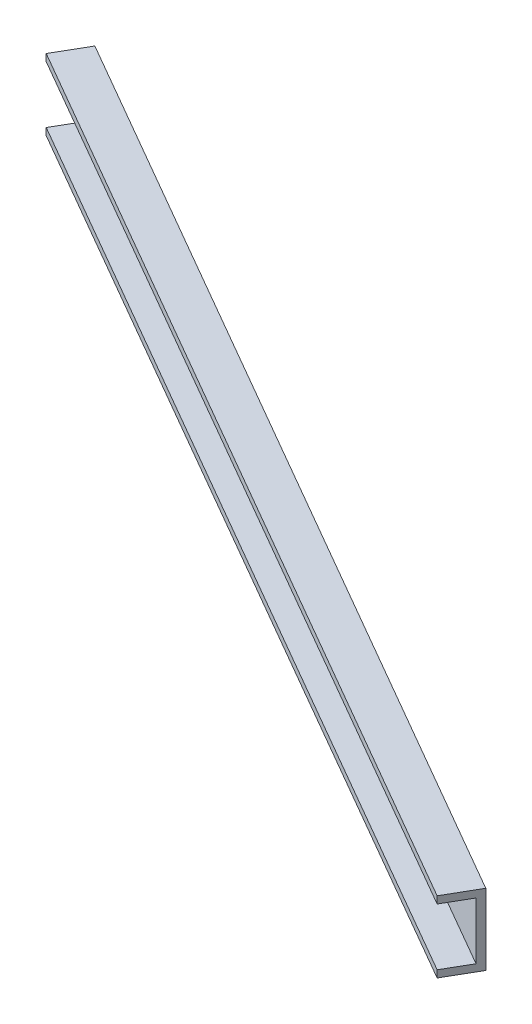
ISO-10303-21;
HEADER;
FILE_DESCRIPTION(('STEP AP214'),'2;1');
FILE_NAME('part.step','',(''),(''),'','','');
FILE_SCHEMA(('AUTOMOTIVE_DESIGN { 1 0 10303 214 1 1 1 1 }'));
ENDSEC;
DATA;
#1=APPLICATION_CONTEXT('core data for automotive mechanical design processes');
#2=APPLICATION_PROTOCOL_DEFINITION('international standard','automotive_design',2000,#1);
#3=PRODUCT_CONTEXT('',#1,'mechanical');
#4=PRODUCT('Part','Part','',(#3));
#5=PRODUCT_RELATED_PRODUCT_CATEGORY('part','',(#4));
#6=PRODUCT_DEFINITION_FORMATION('','',#4);
#7=PRODUCT_DEFINITION_CONTEXT('part definition',#1,'design');
#8=PRODUCT_DEFINITION('design','',#6,#7);
#9=PRODUCT_DEFINITION_SHAPE('','',#8);
#10=(LENGTH_UNIT() NAMED_UNIT(*) SI_UNIT(.MILLI.,.METRE.));
#11=(NAMED_UNIT(*) PLANE_ANGLE_UNIT() SI_UNIT($,.RADIAN.));
#12=(NAMED_UNIT(*) SI_UNIT($,.STERADIAN.) SOLID_ANGLE_UNIT());
#13=UNCERTAINTY_MEASURE_WITH_UNIT(LENGTH_MEASURE(1.E-05),#10,'distance_accuracy_value','');
#14=(GEOMETRIC_REPRESENTATION_CONTEXT(3) GLOBAL_UNCERTAINTY_ASSIGNED_CONTEXT((#13)) GLOBAL_UNIT_ASSIGNED_CONTEXT((#10,
#11,#12)) REPRESENTATION_CONTEXT('',''));
#15=CARTESIAN_POINT('',(0.,0.,0.));
#16=DIRECTION('',(0.,0.,1.));
#17=DIRECTION('',(1.,0.,0.));
#18=AXIS2_PLACEMENT_3D('',#15,#16,#17);
#19=CARTESIAN_POINT('',(-263.807621135332,7.99999999999996,-143.071796769724));
#20=DIRECTION('',(0.,-1.,0.));
#21=DIRECTION('',(0.500000000000001,0.,-0.866025403784439));
#22=AXIS2_PLACEMENT_3D('',#19,#20,#21);
#23=PLANE('',#22);
#24=DIRECTION('',(0.500000000000001,0.,-0.866025403784439));
#25=VECTOR('',#24,1.);
#26=CARTESIAN_POINT('',(-263.807621135332,7.99999999999996,-143.071796769724));
#27=LINE('',#26,#25);
#28=CARTESIAN_POINT('',(-263.807621135332,7.99999999999996,-143.071796769724));
#29=VERTEX_POINT('',#28);
#30=CARTESIAN_POINT('',(-259.807621135332,7.99999999999996,-150.));
#31=VERTEX_POINT('',#30);
#32=EDGE_CURVE('E11',#29,#31,#27,.T.);
#33=ORIENTED_EDGE('',*,*,#32,.T.);
#34=DIRECTION('',(0.866025403784439,0.,0.5));
#35=VECTOR('',#34,1.);
#36=CARTESIAN_POINT('',(-259.807621135332,7.99999999999996,-150.));
#37=LINE('',#36,#35);
#38=CARTESIAN_POINT('',(0.,8.,0.));
#39=VERTEX_POINT('',#38);
#40=EDGE_CURVE('E140',#31,#39,#37,.T.);
#41=ORIENTED_EDGE('',*,*,#40,.T.);
#42=DIRECTION('',(0.500000000000001,0.,-0.866025403784439));
#43=VECTOR('',#42,1.);
#44=CARTESIAN_POINT('',(-4.,8.,6.92820323027553));
#45=LINE('',#44,#43);
#46=CARTESIAN_POINT('',(-4.,8.,6.92820323027553));
#47=VERTEX_POINT('',#46);
#48=EDGE_CURVE('E134',#47,#39,#45,.T.);
#49=ORIENTED_EDGE('',*,*,#48,.F.);
#50=DIRECTION('',(0.866025403784439,0.,0.5));
#51=VECTOR('',#50,1.);
#52=CARTESIAN_POINT('',(-263.807621135332,7.99999999999996,-143.071796769724));
#53=LINE('',#52,#51);
#54=EDGE_CURVE('E96',#29,#47,#53,.T.);
#55=ORIENTED_EDGE('',*,*,#54,.F.);
#56=EDGE_LOOP('',(#33,#41,#49,#55));
#57=FACE_BOUND('',#56,.T.);
#58=ADVANCED_FACE('F16',(#57),#23,.T.);
#59=CARTESIAN_POINT('',(-259.807621135332,7.99999999999996,-150.));
#60=DIRECTION('',(-0.5,0.,0.866025403784439));
#61=DIRECTION('',(0.,-1.,0.));
#62=AXIS2_PLACEMENT_3D('',#59,#60,#61);
#63=PLANE('',#62);
#64=DIRECTION('',(0.,-1.,0.));
#65=VECTOR('',#64,1.);
#66=CARTESIAN_POINT('',(-259.807621135332,7.99999999999996,-150.));
#67=LINE('',#66,#65);
#68=CARTESIAN_POINT('',(-259.807621135332,-8.00000000000004,-150.));
#69=VERTEX_POINT('',#68);
#70=EDGE_CURVE('E23',#31,#69,#67,.T.);
#71=ORIENTED_EDGE('',*,*,#70,.T.);
#72=DIRECTION('',(0.866025403784439,0.,0.5));
#73=VECTOR('',#72,1.);
#74=CARTESIAN_POINT('',(-259.807621135332,-8.00000000000004,-150.));
#75=LINE('',#74,#73);
#76=CARTESIAN_POINT('',(0.,-8.,0.));
#77=VERTEX_POINT('',#76);
#78=EDGE_CURVE('E136',#69,#77,#75,.T.);
#79=ORIENTED_EDGE('',*,*,#78,.T.);
#80=DIRECTION('',(0.,-1.,0.));
#81=VECTOR('',#80,1.);
#82=CARTESIAN_POINT('',(0.,8.,0.));
#83=LINE('',#82,#81);
#84=EDGE_CURVE('E127',#39,#77,#83,.T.);
#85=ORIENTED_EDGE('',*,*,#84,.F.);
#86=ORIENTED_EDGE('',*,*,#40,.F.);
#87=EDGE_LOOP('',(#71,#79,#85,#86));
#88=FACE_BOUND('',#87,.T.);
#89=ADVANCED_FACE('F142',(#88),#63,.T.);
#90=CARTESIAN_POINT('',(-259.807621135332,-8.00000000000004,-150.));
#91=DIRECTION('',(0.,1.,0.));
#92=DIRECTION('',(-0.500000000000001,0.,0.866025403784439));
#93=AXIS2_PLACEMENT_3D('',#90,#91,#92);
#94=PLANE('',#93);
#95=DIRECTION('',(-0.500000000000001,0.,0.866025403784439));
#96=VECTOR('',#95,1.);
#97=CARTESIAN_POINT('',(-259.807621135332,-8.00000000000004,-150.));
#98=LINE('',#97,#96);
#99=CARTESIAN_POINT('',(-263.807621135332,-8.00000000000004,-143.071796769724));
#100=VERTEX_POINT('',#99);
#101=EDGE_CURVE('E138',#69,#100,#98,.T.);
#102=ORIENTED_EDGE('',*,*,#101,.T.);
#103=DIRECTION('',(0.866025403784439,0.,0.5));
#104=VECTOR('',#103,1.);
#105=CARTESIAN_POINT('',(-263.807621135332,-8.00000000000004,-143.071796769724));
#106=LINE('',#105,#104);
#107=CARTESIAN_POINT('',(-4.,-8.,6.9282032302755));
#108=VERTEX_POINT('',#107);
#109=EDGE_CURVE('E130',#100,#108,#106,.T.);
#110=ORIENTED_EDGE('',*,*,#109,.T.);
#111=DIRECTION('',(-0.500000000000001,0.,0.866025403784439));
#112=VECTOR('',#111,1.);
#113=CARTESIAN_POINT('',(0.,-8.,0.));
#114=LINE('',#113,#112);
#115=EDGE_CURVE('E119',#77,#108,#114,.T.);
#116=ORIENTED_EDGE('',*,*,#115,.F.);
#117=ORIENTED_EDGE('',*,*,#78,.F.);
#118=EDGE_LOOP('',(#102,#110,#116,#117));
#119=FACE_BOUND('',#118,.T.);
#120=ADVANCED_FACE('F146',(#119),#94,.T.);
#121=CARTESIAN_POINT('',(-263.807621135332,-8.00000000000004,-143.071796769724));
#122=DIRECTION('',(-0.5,0.,0.866025403784439));
#123=DIRECTION('',(0.,-1.,0.));
#124=AXIS2_PLACEMENT_3D('',#121,#122,#123);
#125=PLANE('',#124);
#126=DIRECTION('',(0.,-1.,0.));
#127=VECTOR('',#126,1.);
#128=CARTESIAN_POINT('',(-263.807621135332,-8.00000000000004,-143.071796769724));
#129=LINE('',#128,#127);
#130=CARTESIAN_POINT('',(-263.807621135332,-10.,-143.071796769724));
#131=VERTEX_POINT('',#130);
#132=EDGE_CURVE('E132',#100,#131,#129,.T.);
#133=ORIENTED_EDGE('',*,*,#132,.T.);
#134=DIRECTION('',(0.866025403784439,0.,0.5));
#135=VECTOR('',#134,1.);
#136=CARTESIAN_POINT('',(-263.807621135332,-10.,-143.071796769724));
#137=LINE('',#136,#135);
#138=CARTESIAN_POINT('',(-4.,-10.,6.9282032302755));
#139=VERTEX_POINT('',#138);
#140=EDGE_CURVE('E122',#131,#139,#137,.T.);
#141=ORIENTED_EDGE('',*,*,#140,.T.);
#142=DIRECTION('',(0.,-1.,0.));
#143=VECTOR('',#142,1.);
#144=CARTESIAN_POINT('',(-4.,-8.,6.9282032302755));
#145=LINE('',#144,#143);
#146=EDGE_CURVE('E112',#108,#139,#145,.T.);
#147=ORIENTED_EDGE('',*,*,#146,.F.);
#148=ORIENTED_EDGE('',*,*,#109,.F.);
#149=EDGE_LOOP('',(#133,#141,#147,#148));
#150=FACE_BOUND('',#149,.T.);
#151=ADVANCED_FACE('F151',(#150),#125,.T.);
#152=CARTESIAN_POINT('',(-263.807621135332,-10.,-143.071796769724));
#153=DIRECTION('',(0.,-1.,0.));
#154=DIRECTION('',(0.500000000000001,0.,-0.866025403784438));
#155=AXIS2_PLACEMENT_3D('',#152,#153,#154);
#156=PLANE('',#155);
#157=DIRECTION('',(0.500000000000001,0.,-0.866025403784438));
#158=VECTOR('',#157,1.);
#159=CARTESIAN_POINT('',(-263.807621135332,-10.,-143.071796769724));
#160=LINE('',#159,#158);
#161=CARTESIAN_POINT('',(-258.807621135332,-10.,-151.732050807569));
#162=VERTEX_POINT('',#161);
#163=EDGE_CURVE('E124',#131,#162,#160,.T.);
#164=ORIENTED_EDGE('',*,*,#163,.T.);
#165=DIRECTION('',(0.866025403784439,0.,0.5));
#166=VECTOR('',#165,1.);
#167=CARTESIAN_POINT('',(-258.807621135332,-10.,-151.732050807569));
#168=LINE('',#167,#166);
#169=CARTESIAN_POINT('',(1.,-10.,-1.73205080756887));
#170=VERTEX_POINT('',#169);
#171=EDGE_CURVE('E115',#162,#170,#168,.T.);
#172=ORIENTED_EDGE('',*,*,#171,.T.);
#173=DIRECTION('',(0.500000000000002,0.,-0.866025403784437));
#174=VECTOR('',#173,1.);
#175=CARTESIAN_POINT('',(-4.,-10.,6.9282032302755));
#176=LINE('',#175,#174);
#177=EDGE_CURVE('E107',#139,#170,#176,.T.);
#178=ORIENTED_EDGE('',*,*,#177,.F.);
#179=ORIENTED_EDGE('',*,*,#140,.F.);
#180=EDGE_LOOP('',(#164,#172,#178,#179));
#181=FACE_BOUND('',#180,.T.);
#182=ADVANCED_FACE('F156',(#181),#156,.T.);
#183=CARTESIAN_POINT('',(-258.807621135332,-10.,-151.732050807569));
#184=DIRECTION('',(0.5,0.,-0.866025403784439));
#185=DIRECTION('',(0.,1.,0.));
#186=AXIS2_PLACEMENT_3D('',#183,#184,#185);
#187=PLANE('',#186);
#188=DIRECTION('',(0.,1.,0.));
#189=VECTOR('',#188,1.);
#190=CARTESIAN_POINT('',(-258.807621135332,-10.,-151.732050807569));
#191=LINE('',#190,#189);
#192=CARTESIAN_POINT('',(-258.807621135332,9.99999999999996,-151.732050807569));
#193=VERTEX_POINT('',#192);
#194=EDGE_CURVE('E117',#162,#193,#191,.T.);
#195=ORIENTED_EDGE('',*,*,#194,.T.);
#196=DIRECTION('',(0.866025403784439,0.,0.5));
#197=VECTOR('',#196,1.);
#198=CARTESIAN_POINT('',(-258.807621135332,9.99999999999996,-151.732050807569));
#199=LINE('',#198,#197);
#200=CARTESIAN_POINT('',(1.,10.,-1.73205080756887));
#201=VERTEX_POINT('',#200);
#202=EDGE_CURVE('E109',#193,#201,#199,.T.);
#203=ORIENTED_EDGE('',*,*,#202,.T.);
#204=DIRECTION('',(0.,1.,0.));
#205=VECTOR('',#204,1.);
#206=CARTESIAN_POINT('',(1.,-10.,-1.73205080756887));
#207=LINE('',#206,#205);
#208=EDGE_CURVE('E90',#170,#201,#207,.T.);
#209=ORIENTED_EDGE('',*,*,#208,.F.);
#210=ORIENTED_EDGE('',*,*,#171,.F.);
#211=EDGE_LOOP('',(#195,#203,#209,#210));
#212=FACE_BOUND('',#211,.T.);
#213=ADVANCED_FACE('F160',(#212),#187,.T.);
#214=CARTESIAN_POINT('',(-258.807621135332,9.99999999999996,-151.732050807569));
#215=DIRECTION('',(0.,1.,0.));
#216=DIRECTION('',(-0.500000000000001,0.,0.866025403784438));
#217=AXIS2_PLACEMENT_3D('',#214,#215,#216);
#218=PLANE('',#217);
#219=DIRECTION('',(-0.500000000000001,0.,0.866025403784438));
#220=VECTOR('',#219,1.);
#221=CARTESIAN_POINT('',(-258.807621135332,9.99999999999996,-151.732050807569));
#222=LINE('',#221,#220);
#223=CARTESIAN_POINT('',(-263.807621135332,9.99999999999996,-143.071796769724));
#224=VERTEX_POINT('',#223);
#225=EDGE_CURVE('E85',#193,#224,#222,.T.);
#226=ORIENTED_EDGE('',*,*,#225,.T.);
#227=DIRECTION('',(0.866025403784439,0.,0.5));
#228=VECTOR('',#227,1.);
#229=CARTESIAN_POINT('',(-263.807621135332,9.99999999999996,-143.071796769724));
#230=LINE('',#229,#228);
#231=CARTESIAN_POINT('',(-4.,10.,6.9282032302755));
#232=VERTEX_POINT('',#231);
#233=EDGE_CURVE('E77',#224,#232,#230,.T.);
#234=ORIENTED_EDGE('',*,*,#233,.T.);
#235=DIRECTION('',(-0.5,0.,0.866025403784439));
#236=VECTOR('',#235,1.);
#237=CARTESIAN_POINT('',(1.,10.,-1.73205080756887));
#238=LINE('',#237,#236);
#239=EDGE_CURVE('E82',#201,#232,#238,.T.);
#240=ORIENTED_EDGE('',*,*,#239,.F.);
#241=ORIENTED_EDGE('',*,*,#202,.F.);
#242=EDGE_LOOP('',(#226,#234,#240,#241));
#243=FACE_BOUND('',#242,.T.);
#244=ADVANCED_FACE('F79',(#243),#218,.T.);
#245=CARTESIAN_POINT('',(-263.807621135332,9.99999999999996,-143.071796769724));
#246=DIRECTION('',(-0.5,0.,0.866025403784439));
#247=DIRECTION('',(0.,-1.,0.));
#248=AXIS2_PLACEMENT_3D('',#245,#246,#247);
#249=PLANE('',#248);
#250=DIRECTION('',(0.,-1.,0.));
#251=VECTOR('',#250,1.);
#252=CARTESIAN_POINT('',(-263.807621135332,9.99999999999996,-143.071796769724));
#253=LINE('',#252,#251);
#254=EDGE_CURVE('E89',#224,#29,#253,.T.);
#255=ORIENTED_EDGE('',*,*,#254,.T.);
#256=ORIENTED_EDGE('',*,*,#54,.T.);
#257=DIRECTION('',(0.,-1.,0.));
#258=VECTOR('',#257,1.);
#259=CARTESIAN_POINT('',(-4.,10.,6.9282032302755));
#260=LINE('',#259,#258);
#261=EDGE_CURVE('E94',#232,#47,#260,.T.);
#262=ORIENTED_EDGE('',*,*,#261,.F.);
#263=ORIENTED_EDGE('',*,*,#233,.F.);
#264=EDGE_LOOP('',(#255,#256,#262,#263));
#265=FACE_BOUND('',#264,.T.);
#266=ADVANCED_FACE('F95',(#265),#249,.T.);
#267=CARTESIAN_POINT('',(0.,0.,0.));
#268=DIRECTION('',(0.866025403784439,0.,0.5));
#269=DIRECTION('',(0.,1.,0.));
#270=AXIS2_PLACEMENT_3D('',#267,#268,#269);
#271=PLANE('',#270);
#272=ORIENTED_EDGE('',*,*,#48,.T.);
#273=ORIENTED_EDGE('',*,*,#84,.T.);
#274=ORIENTED_EDGE('',*,*,#115,.T.);
#275=ORIENTED_EDGE('',*,*,#146,.T.);
#276=ORIENTED_EDGE('',*,*,#177,.T.);
#277=ORIENTED_EDGE('',*,*,#208,.T.);
#278=ORIENTED_EDGE('',*,*,#239,.T.);
#279=ORIENTED_EDGE('',*,*,#261,.T.);
#280=EDGE_LOOP('',(#272,#273,#274,#275,#276,#277,#278,#279));
#281=FACE_BOUND('',#280,.T.);
#282=ADVANCED_FACE('F100',(#281),#271,.T.);
#283=CARTESIAN_POINT('',(-259.807621135332,0.,-150.));
#284=DIRECTION('',(0.866025403784439,0.,0.5));
#285=DIRECTION('',(0.,1.,0.));
#286=AXIS2_PLACEMENT_3D('',#283,#284,#285);
#287=PLANE('',#286);
#288=ORIENTED_EDGE('',*,*,#254,.F.);
#289=ORIENTED_EDGE('',*,*,#225,.F.);
#290=ORIENTED_EDGE('',*,*,#194,.F.);
#291=ORIENTED_EDGE('',*,*,#163,.F.);
#292=ORIENTED_EDGE('',*,*,#132,.F.);
#293=ORIENTED_EDGE('',*,*,#101,.F.);
#294=ORIENTED_EDGE('',*,*,#70,.F.);
#295=ORIENTED_EDGE('',*,*,#32,.F.);
#296=EDGE_LOOP('',(#288,#289,#290,#291,#292,#293,#294,#295));
#297=FACE_BOUND('',#296,.T.);
#298=ADVANCED_FACE('F162',(#297),#287,.F.);
#299=CLOSED_SHELL('',(#58,#89,#120,#151,#182,#213,#244,#266,#282,#298));
#300=MANIFOLD_SOLID_BREP('B1',#299);
#301=ADVANCED_BREP_SHAPE_REPRESENTATION('',(#18,#300),#14);
#302=SHAPE_DEFINITION_REPRESENTATION(#9,#301);
ENDSEC;
END-ISO-10303-21;
